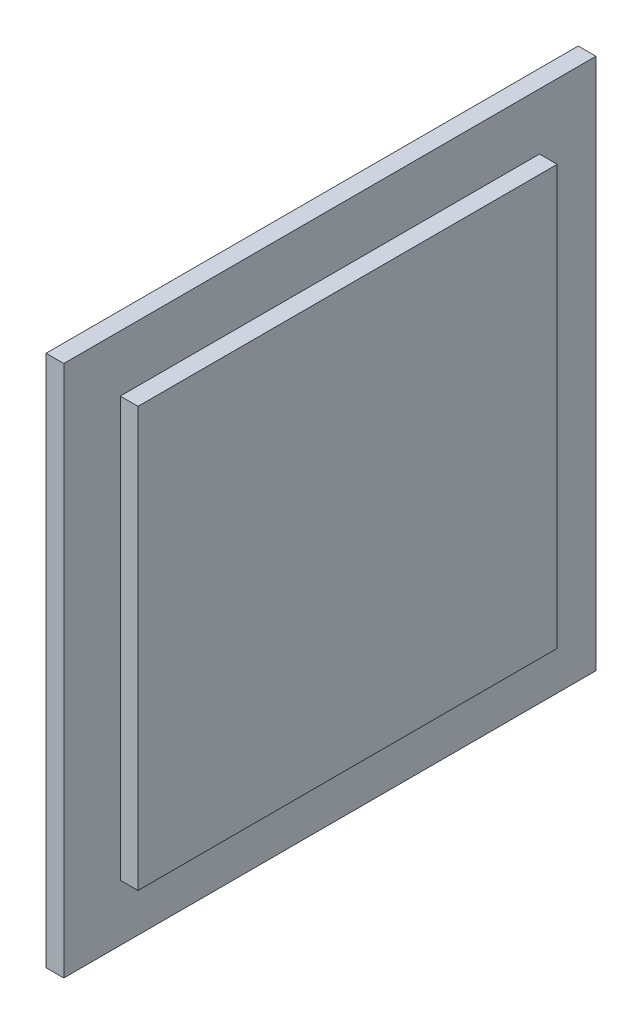
ISO-10303-21;
HEADER;
FILE_DESCRIPTION(('STEP AP214'),'2;1');
FILE_NAME('part.step','',(''),(''),'','','');
FILE_SCHEMA(('AUTOMOTIVE_DESIGN { 1 0 10303 214 1 1 1 1 }'));
ENDSEC;
DATA;
#1=APPLICATION_CONTEXT('core data for automotive mechanical design processes');
#2=APPLICATION_PROTOCOL_DEFINITION('international standard','automotive_design',2000,#1);
#3=PRODUCT_CONTEXT('',#1,'mechanical');
#4=PRODUCT('Part','Part','',(#3));
#5=PRODUCT_RELATED_PRODUCT_CATEGORY('part','',(#4));
#6=PRODUCT_DEFINITION_FORMATION('','',#4);
#7=PRODUCT_DEFINITION_CONTEXT('part definition',#1,'design');
#8=PRODUCT_DEFINITION('design','',#6,#7);
#9=PRODUCT_DEFINITION_SHAPE('','',#8);
#10=(LENGTH_UNIT() NAMED_UNIT(*) SI_UNIT(.MILLI.,.METRE.));
#11=(NAMED_UNIT(*) PLANE_ANGLE_UNIT() SI_UNIT($,.RADIAN.));
#12=(NAMED_UNIT(*) SI_UNIT($,.STERADIAN.) SOLID_ANGLE_UNIT());
#13=UNCERTAINTY_MEASURE_WITH_UNIT(LENGTH_MEASURE(1.E-05),#10,'distance_accuracy_value','');
#14=(GEOMETRIC_REPRESENTATION_CONTEXT(3) GLOBAL_UNCERTAINTY_ASSIGNED_CONTEXT((#13)) GLOBAL_UNIT_ASSIGNED_CONTEXT((#10,
#11,#12)) REPRESENTATION_CONTEXT('',''));
#15=CARTESIAN_POINT('',(0.,0.,0.));
#16=DIRECTION('',(0.,0.,1.));
#17=DIRECTION('',(1.,0.,0.));
#18=AXIS2_PLACEMENT_3D('',#15,#16,#17);
#19=CARTESIAN_POINT('',(7.62,0.,0.));
#20=DIRECTION('',(1.,0.,0.));
#21=DIRECTION('',(0.,0.,-1.));
#22=AXIS2_PLACEMENT_3D('',#19,#20,#21);
#23=PLANE('',#22);
#24=DIRECTION('',(0.,-1.,0.));
#25=VECTOR('',#24,1.);
#26=CARTESIAN_POINT('',(7.62,0.,-228.6));
#27=LINE('',#26,#25);
#28=CARTESIAN_POINT('',(7.62,0.,-228.6));
#29=VERTEX_POINT('',#28);
#30=CARTESIAN_POINT('',(7.62,-228.6,-228.6));
#31=VERTEX_POINT('',#30);
#32=EDGE_CURVE('E156',#29,#31,#27,.T.);
#33=ORIENTED_EDGE('',*,*,#32,.F.);
#34=DIRECTION('',(0.,0.,-1.));
#35=VECTOR('',#34,1.);
#36=CARTESIAN_POINT('',(7.62,0.,0.));
#37=LINE('',#36,#35);
#38=CARTESIAN_POINT('',(7.62,0.,0.));
#39=VERTEX_POINT('',#38);
#40=EDGE_CURVE('E160',#39,#29,#37,.T.);
#41=ORIENTED_EDGE('',*,*,#40,.F.);
#42=DIRECTION('',(0.,-1.,0.));
#43=VECTOR('',#42,1.);
#44=CARTESIAN_POINT('',(7.62,0.,0.));
#45=LINE('',#44,#43);
#46=CARTESIAN_POINT('',(7.62,-228.6,0.));
#47=VERTEX_POINT('',#46);
#48=EDGE_CURVE('E165',#39,#47,#45,.T.);
#49=ORIENTED_EDGE('',*,*,#48,.T.);
#50=DIRECTION('',(0.,0.,-1.));
#51=VECTOR('',#50,1.);
#52=CARTESIAN_POINT('',(7.62,-228.6,0.));
#53=LINE('',#52,#51);
#54=EDGE_CURVE('E168',#47,#31,#53,.T.);
#55=ORIENTED_EDGE('',*,*,#54,.T.);
#56=EDGE_LOOP('',(#33,#41,#49,#55));
#57=FACE_BOUND('',#56,.T.);
#58=DIRECTION('',(0.,1.,0.));
#59=VECTOR('',#58,1.);
#60=CARTESIAN_POINT('',(7.62,0.,-204.343));
#61=LINE('',#60,#59);
#62=CARTESIAN_POINT('',(7.62,-204.343,-204.343));
#63=VERTEX_POINT('',#62);
#64=CARTESIAN_POINT('',(7.62,-24.257,-204.343));
#65=VERTEX_POINT('',#64);
#66=EDGE_CURVE('E129',#63,#65,#61,.T.);
#67=ORIENTED_EDGE('',*,*,#66,.F.);
#68=DIRECTION('',(0.,0.,1.));
#69=VECTOR('',#68,1.);
#70=CARTESIAN_POINT('',(7.62,-204.343,0.));
#71=LINE('',#70,#69);
#72=CARTESIAN_POINT('',(7.62,-204.343,-24.257));
#73=VERTEX_POINT('',#72);
#74=EDGE_CURVE('E58',#63,#73,#71,.T.);
#75=ORIENTED_EDGE('',*,*,#74,.T.);
#76=DIRECTION('',(0.,1.,0.));
#77=VECTOR('',#76,1.);
#78=CARTESIAN_POINT('',(7.62,0.,-24.257));
#79=LINE('',#78,#77);
#80=CARTESIAN_POINT('',(7.62,-24.257,-24.257));
#81=VERTEX_POINT('',#80);
#82=EDGE_CURVE('E63',#73,#81,#79,.T.);
#83=ORIENTED_EDGE('',*,*,#82,.T.);
#84=DIRECTION('',(0.,0.,1.));
#85=VECTOR('',#84,1.);
#86=CARTESIAN_POINT('',(7.62,-24.257,0.));
#87=LINE('',#86,#85);
#88=EDGE_CURVE('E133',#65,#81,#87,.T.);
#89=ORIENTED_EDGE('',*,*,#88,.F.);
#90=EDGE_LOOP('',(#67,#75,#83,#89));
#91=FACE_BOUND('',#90,.T.);
#92=ADVANCED_FACE('F42',(#57,#91),#23,.T.);
#93=CARTESIAN_POINT('',(7.62,0.,-228.6));
#94=DIRECTION('',(0.,0.,-1.));
#95=DIRECTION('',(0.,1.,0.));
#96=AXIS2_PLACEMENT_3D('',#93,#94,#95);
#97=PLANE('',#96);
#98=DIRECTION('',(0.,-1.,0.));
#99=VECTOR('',#98,1.);
#100=CARTESIAN_POINT('',(0.,0.,-228.6));
#101=LINE('',#100,#99);
#102=CARTESIAN_POINT('',(0.,0.,-228.6));
#103=VERTEX_POINT('',#102);
#104=CARTESIAN_POINT('',(0.,-228.6,-228.6));
#105=VERTEX_POINT('',#104);
#106=EDGE_CURVE('E149',#103,#105,#101,.T.);
#107=ORIENTED_EDGE('',*,*,#106,.F.);
#108=DIRECTION('',(-1.,0.,0.));
#109=VECTOR('',#108,1.);
#110=CARTESIAN_POINT('',(7.62,0.,-228.6));
#111=LINE('',#110,#109);
#112=EDGE_CURVE('E11',#29,#103,#111,.T.);
#113=ORIENTED_EDGE('',*,*,#112,.F.);
#114=ORIENTED_EDGE('',*,*,#32,.T.);
#115=DIRECTION('',(-1.,0.,0.));
#116=VECTOR('',#115,1.);
#117=CARTESIAN_POINT('',(7.62,-228.6,-228.6));
#118=LINE('',#117,#116);
#119=EDGE_CURVE('E171',#31,#105,#118,.T.);
#120=ORIENTED_EDGE('',*,*,#119,.T.);
#121=EDGE_LOOP('',(#107,#113,#114,#120));
#122=FACE_BOUND('',#121,.T.);
#123=ADVANCED_FACE('F44',(#122),#97,.T.);
#124=CARTESIAN_POINT('',(7.62,0.,0.));
#125=DIRECTION('',(0.,1.,0.));
#126=DIRECTION('',(0.,0.,1.));
#127=AXIS2_PLACEMENT_3D('',#124,#125,#126);
#128=PLANE('',#127);
#129=DIRECTION('',(0.,0.,-1.));
#130=VECTOR('',#129,1.);
#131=CARTESIAN_POINT('',(0.,0.,0.));
#132=LINE('',#131,#130);
#133=CARTESIAN_POINT('',(0.,0.,0.));
#134=VERTEX_POINT('',#133);
#135=EDGE_CURVE('E175',#134,#103,#132,.T.);
#136=ORIENTED_EDGE('',*,*,#135,.F.);
#137=DIRECTION('',(-1.,0.,0.));
#138=VECTOR('',#137,1.);
#139=CARTESIAN_POINT('',(7.62,0.,0.));
#140=LINE('',#139,#138);
#141=EDGE_CURVE('E51',#39,#134,#140,.T.);
#142=ORIENTED_EDGE('',*,*,#141,.F.);
#143=ORIENTED_EDGE('',*,*,#40,.T.);
#144=ORIENTED_EDGE('',*,*,#112,.T.);
#145=EDGE_LOOP('',(#136,#142,#143,#144));
#146=FACE_BOUND('',#145,.T.);
#147=ADVANCED_FACE('F202',(#146),#128,.T.);
#148=CARTESIAN_POINT('',(7.62,0.,0.));
#149=DIRECTION('',(0.,0.,-1.));
#150=DIRECTION('',(0.,1.,0.));
#151=AXIS2_PLACEMENT_3D('',#148,#149,#150);
#152=PLANE('',#151);
#153=DIRECTION('',(0.,-1.,0.));
#154=VECTOR('',#153,1.);
#155=CARTESIAN_POINT('',(0.,0.,0.));
#156=LINE('',#155,#154);
#157=CARTESIAN_POINT('',(0.,-228.6,0.));
#158=VERTEX_POINT('',#157);
#159=EDGE_CURVE('E179',#134,#158,#156,.T.);
#160=ORIENTED_EDGE('',*,*,#159,.T.);
#161=DIRECTION('',(-1.,0.,0.));
#162=VECTOR('',#161,1.);
#163=CARTESIAN_POINT('',(7.62,-228.6,0.));
#164=LINE('',#163,#162);
#165=EDGE_CURVE('E187',#47,#158,#164,.T.);
#166=ORIENTED_EDGE('',*,*,#165,.F.);
#167=ORIENTED_EDGE('',*,*,#48,.F.);
#168=ORIENTED_EDGE('',*,*,#141,.T.);
#169=EDGE_LOOP('',(#160,#166,#167,#168));
#170=FACE_BOUND('',#169,.T.);
#171=ADVANCED_FACE('F194',(#170),#152,.F.);
#172=CARTESIAN_POINT('',(7.62,-228.6,0.));
#173=DIRECTION('',(0.,1.,0.));
#174=DIRECTION('',(0.,0.,1.));
#175=AXIS2_PLACEMENT_3D('',#172,#173,#174);
#176=PLANE('',#175);
#177=DIRECTION('',(0.,0.,-1.));
#178=VECTOR('',#177,1.);
#179=CARTESIAN_POINT('',(0.,-228.6,0.));
#180=LINE('',#179,#178);
#181=EDGE_CURVE('E161',#158,#105,#180,.T.);
#182=ORIENTED_EDGE('',*,*,#181,.T.);
#183=ORIENTED_EDGE('',*,*,#119,.F.);
#184=ORIENTED_EDGE('',*,*,#54,.F.);
#185=ORIENTED_EDGE('',*,*,#165,.T.);
#186=EDGE_LOOP('',(#182,#183,#184,#185));
#187=FACE_BOUND('',#186,.T.);
#188=ADVANCED_FACE('F209',(#187),#176,.F.);
#189=CARTESIAN_POINT('',(0.,0.,0.));
#190=DIRECTION('',(1.,0.,0.));
#191=DIRECTION('',(0.,0.,-1.));
#192=AXIS2_PLACEMENT_3D('',#189,#190,#191);
#193=PLANE('',#192);
#194=ORIENTED_EDGE('',*,*,#106,.T.);
#195=ORIENTED_EDGE('',*,*,#181,.F.);
#196=ORIENTED_EDGE('',*,*,#159,.F.);
#197=ORIENTED_EDGE('',*,*,#135,.T.);
#198=EDGE_LOOP('',(#194,#195,#196,#197));
#199=FACE_BOUND('',#198,.T.);
#200=ADVANCED_FACE('F201',(#199),#193,.F.);
#201=CARTESIAN_POINT('',(15.24,-204.343,0.));
#202=DIRECTION('',(0.,-1.,0.));
#203=DIRECTION('',(0.,0.,-1.));
#204=AXIS2_PLACEMENT_3D('',#201,#202,#203);
#205=PLANE('',#204);
#206=ORIENTED_EDGE('',*,*,#74,.F.);
#207=DIRECTION('',(-1.,0.,0.));
#208=VECTOR('',#207,1.);
#209=CARTESIAN_POINT('',(15.24,-204.343,-204.343));
#210=LINE('',#209,#208);
#211=CARTESIAN_POINT('',(15.24,-204.343,-204.343));
#212=VERTEX_POINT('',#211);
#213=EDGE_CURVE('E126',#212,#63,#210,.T.);
#214=ORIENTED_EDGE('',*,*,#213,.F.);
#215=DIRECTION('',(0.,0.,1.));
#216=VECTOR('',#215,1.);
#217=CARTESIAN_POINT('',(15.24,-204.343,0.));
#218=LINE('',#217,#216);
#219=CARTESIAN_POINT('',(15.24,-204.343,-24.257));
#220=VERTEX_POINT('',#219);
#221=EDGE_CURVE('E118',#212,#220,#218,.T.);
#222=ORIENTED_EDGE('',*,*,#221,.T.);
#223=DIRECTION('',(-1.,0.,0.));
#224=VECTOR('',#223,1.);
#225=CARTESIAN_POINT('',(15.24,-204.343,-24.257));
#226=LINE('',#225,#224);
#227=EDGE_CURVE('E105',#220,#73,#226,.T.);
#228=ORIENTED_EDGE('',*,*,#227,.T.);
#229=EDGE_LOOP('',(#206,#214,#222,#228));
#230=FACE_BOUND('',#229,.T.);
#231=ADVANCED_FACE('F124',(#230),#205,.T.);
#232=CARTESIAN_POINT('',(15.24,0.,-204.343));
#233=DIRECTION('',(0.,0.,1.));
#234=DIRECTION('',(0.,-1.,0.));
#235=AXIS2_PLACEMENT_3D('',#232,#233,#234);
#236=PLANE('',#235);
#237=ORIENTED_EDGE('',*,*,#66,.T.);
#238=DIRECTION('',(-1.,0.,0.));
#239=VECTOR('',#238,1.);
#240=CARTESIAN_POINT('',(15.24,-24.257,-204.343));
#241=LINE('',#240,#239);
#242=CARTESIAN_POINT('',(15.24,-24.257,-204.343));
#243=VERTEX_POINT('',#242);
#244=EDGE_CURVE('E150',#243,#65,#241,.T.);
#245=ORIENTED_EDGE('',*,*,#244,.F.);
#246=DIRECTION('',(0.,1.,0.));
#247=VECTOR('',#246,1.);
#248=CARTESIAN_POINT('',(15.24,0.,-204.343));
#249=LINE('',#248,#247);
#250=EDGE_CURVE('E113',#212,#243,#249,.T.);
#251=ORIENTED_EDGE('',*,*,#250,.F.);
#252=ORIENTED_EDGE('',*,*,#213,.T.);
#253=EDGE_LOOP('',(#237,#245,#251,#252));
#254=FACE_BOUND('',#253,.T.);
#255=ADVANCED_FACE('F215',(#254),#236,.F.);
#256=CARTESIAN_POINT('',(15.24,-24.257,0.));
#257=DIRECTION('',(0.,-1.,0.));
#258=DIRECTION('',(0.,0.,-1.));
#259=AXIS2_PLACEMENT_3D('',#256,#257,#258);
#260=PLANE('',#259);
#261=ORIENTED_EDGE('',*,*,#88,.T.);
#262=DIRECTION('',(-1.,0.,0.));
#263=VECTOR('',#262,1.);
#264=CARTESIAN_POINT('',(15.24,-24.257,-24.257));
#265=LINE('',#264,#263);
#266=CARTESIAN_POINT('',(15.24,-24.257,-24.257));
#267=VERTEX_POINT('',#266);
#268=EDGE_CURVE('E112',#267,#81,#265,.T.);
#269=ORIENTED_EDGE('',*,*,#268,.F.);
#270=DIRECTION('',(0.,0.,1.));
#271=VECTOR('',#270,1.);
#272=CARTESIAN_POINT('',(15.24,-24.257,0.));
#273=LINE('',#272,#271);
#274=EDGE_CURVE('E120',#243,#267,#273,.T.);
#275=ORIENTED_EDGE('',*,*,#274,.F.);
#276=ORIENTED_EDGE('',*,*,#244,.T.);
#277=EDGE_LOOP('',(#261,#269,#275,#276));
#278=FACE_BOUND('',#277,.T.);
#279=ADVANCED_FACE('F217',(#278),#260,.F.);
#280=CARTESIAN_POINT('',(15.24,0.,-24.257));
#281=DIRECTION('',(0.,0.,1.));
#282=DIRECTION('',(0.,-1.,0.));
#283=AXIS2_PLACEMENT_3D('',#280,#281,#282);
#284=PLANE('',#283);
#285=ORIENTED_EDGE('',*,*,#82,.F.);
#286=ORIENTED_EDGE('',*,*,#227,.F.);
#287=DIRECTION('',(0.,1.,0.));
#288=VECTOR('',#287,1.);
#289=CARTESIAN_POINT('',(15.24,0.,-24.257));
#290=LINE('',#289,#288);
#291=EDGE_CURVE('E108',#220,#267,#290,.T.);
#292=ORIENTED_EDGE('',*,*,#291,.T.);
#293=ORIENTED_EDGE('',*,*,#268,.T.);
#294=EDGE_LOOP('',(#285,#286,#292,#293));
#295=FACE_BOUND('',#294,.T.);
#296=ADVANCED_FACE('F107',(#295),#284,.T.);
#297=CARTESIAN_POINT('',(15.24,0.,0.));
#298=DIRECTION('',(-1.,0.,0.));
#299=DIRECTION('',(0.,0.,1.));
#300=AXIS2_PLACEMENT_3D('',#297,#298,#299);
#301=PLANE('',#300);
#302=ORIENTED_EDGE('',*,*,#221,.F.);
#303=ORIENTED_EDGE('',*,*,#250,.T.);
#304=ORIENTED_EDGE('',*,*,#274,.T.);
#305=ORIENTED_EDGE('',*,*,#291,.F.);
#306=EDGE_LOOP('',(#302,#303,#304,#305));
#307=FACE_BOUND('',#306,.T.);
#308=ADVANCED_FACE('F117',(#307),#301,.F.);
#309=CLOSED_SHELL('',(#92,#123,#147,#171,#188,#200,#231,#255,#279,#296,#308));
#310=MANIFOLD_SOLID_BREP('B2',#309);
#311=ADVANCED_BREP_SHAPE_REPRESENTATION('',(#18,#310),#14);
#312=SHAPE_DEFINITION_REPRESENTATION(#9,#311);
ENDSEC;
END-ISO-10303-21;
